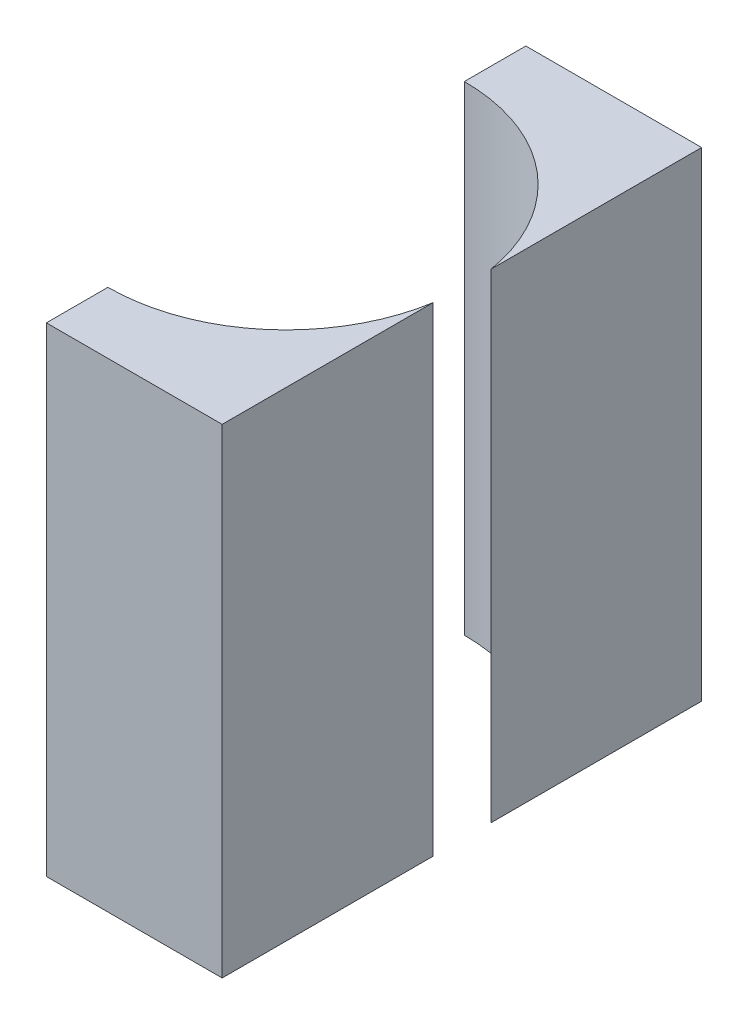
ISO-10303-21;
HEADER;
FILE_DESCRIPTION(('STEP AP214'),'2;1');
FILE_NAME('part.step','',(''),(''),'','','');
FILE_SCHEMA(('AUTOMOTIVE_DESIGN { 1 0 10303 214 1 1 1 1 }'));
ENDSEC;
DATA;
#1=APPLICATION_CONTEXT('core data for automotive mechanical design processes');
#2=APPLICATION_PROTOCOL_DEFINITION('international standard','automotive_design',2000,#1);
#3=PRODUCT_CONTEXT('',#1,'mechanical');
#4=PRODUCT('Part','Part','',(#3));
#5=PRODUCT_RELATED_PRODUCT_CATEGORY('part','',(#4));
#6=PRODUCT_DEFINITION_FORMATION('','',#4);
#7=PRODUCT_DEFINITION_CONTEXT('part definition',#1,'design');
#8=PRODUCT_DEFINITION('design','',#6,#7);
#9=PRODUCT_DEFINITION_SHAPE('','',#8);
#10=(LENGTH_UNIT() NAMED_UNIT(*) SI_UNIT(.MILLI.,.METRE.));
#11=(NAMED_UNIT(*) PLANE_ANGLE_UNIT() SI_UNIT($,.RADIAN.));
#12=(NAMED_UNIT(*) SI_UNIT($,.STERADIAN.) SOLID_ANGLE_UNIT());
#13=UNCERTAINTY_MEASURE_WITH_UNIT(LENGTH_MEASURE(1.E-05),#10,'distance_accuracy_value','');
#14=(GEOMETRIC_REPRESENTATION_CONTEXT(3) GLOBAL_UNCERTAINTY_ASSIGNED_CONTEXT((#13)) GLOBAL_UNIT_ASSIGNED_CONTEXT((#10,
#11,#12)) REPRESENTATION_CONTEXT('',''));
#15=CARTESIAN_POINT('',(0.,0.,0.));
#16=DIRECTION('',(0.,0.,1.));
#17=DIRECTION('',(1.,0.,0.));
#18=AXIS2_PLACEMENT_3D('',#15,#16,#17);
#19=CARTESIAN_POINT('',(234.78754847334,39.5040110499967,-22.2466848749254));
#20=DIRECTION('',(0.,1.,0.));
#21=DIRECTION('',(-1.,0.,0.));
#22=AXIS2_PLACEMENT_3D('',#19,#20,#21);
#23=CYLINDRICAL_SURFACE('',#22,11.15);
#24=CARTESIAN_POINT('',(234.78754847334,56.6690721218171,-22.2466848749254));
#25=DIRECTION('',(0.,-1.,0.));
#26=DIRECTION('',(1.,0.,0.));
#27=AXIS2_PLACEMENT_3D('',#24,#25,#26);
#28=CIRCLE('',#27,11.15);
#29=CARTESIAN_POINT('',(245.78754847334,56.6690721218171,-24.0694574882816));
#30=VERTEX_POINT('',#29);
#31=CARTESIAN_POINT('',(234.78754847334,56.6690721218171,-33.3966848749254));
#32=VERTEX_POINT('',#31);
#33=EDGE_CURVE('E12',#30,#32,#28,.F.);
#34=ORIENTED_EDGE('',*,*,#33,.F.);
#35=DIRECTION('',(0.,1.,0.));
#36=VECTOR('',#35,1.);
#37=CARTESIAN_POINT('',(245.78754847334,39.5040110499967,-24.0694574882816));
#38=LINE('',#37,#36);
#39=CARTESIAN_POINT('',(245.78754847334,86.6690721218171,-24.0694574882816));
#40=VERTEX_POINT('',#39);
#41=EDGE_CURVE('E55',#30,#40,#38,.T.);
#42=ORIENTED_EDGE('',*,*,#41,.T.);
#43=CARTESIAN_POINT('',(234.78754847334,86.6690721218171,-22.2466848749254));
#44=DIRECTION('',(0.,1.,0.));
#45=DIRECTION('',(0.,0.,1.));
#46=AXIS2_PLACEMENT_3D('',#43,#44,#45);
#47=CIRCLE('',#46,11.15);
#48=CARTESIAN_POINT('',(234.78754847334,86.6690721218171,-33.3966848749254));
#49=VERTEX_POINT('',#48);
#50=EDGE_CURVE('E116',#40,#49,#47,.T.);
#51=ORIENTED_EDGE('',*,*,#50,.T.);
#52=DIRECTION('',(0.,1.,0.));
#53=VECTOR('',#52,1.);
#54=CARTESIAN_POINT('',(234.78754847334,39.5040110499967,-33.3966848749254));
#55=LINE('',#54,#53);
#56=EDGE_CURVE('E110',#32,#49,#55,.T.);
#57=ORIENTED_EDGE('',*,*,#56,.F.);
#58=EDGE_LOOP('',(#34,#42,#51,#57));
#59=FACE_BOUND('',#58,.T.);
#60=ADVANCED_FACE('F51',(#59),#23,.F.);
#61=CARTESIAN_POINT('',(234.78754847334,39.5040110499967,0.));
#62=DIRECTION('',(-1.,0.,0.));
#63=DIRECTION('',(0.,-1.,0.));
#64=AXIS2_PLACEMENT_3D('',#61,#62,#63);
#65=PLANE('',#64);
#66=DIRECTION('',(0.,1.,0.));
#67=VECTOR('',#66,1.);
#68=CARTESIAN_POINT('',(234.78754847334,39.5040110499967,-37.2466848749251));
#69=LINE('',#68,#67);
#70=CARTESIAN_POINT('',(234.78754847334,56.6690721218171,-37.2466848749251));
#71=VERTEX_POINT('',#70);
#72=CARTESIAN_POINT('',(234.78754847334,86.6690721218171,-37.2466848749251));
#73=VERTEX_POINT('',#72);
#74=EDGE_CURVE('E104',#71,#73,#69,.T.);
#75=ORIENTED_EDGE('',*,*,#74,.F.);
#76=DIRECTION('',(0.,0.,1.));
#77=VECTOR('',#76,1.);
#78=CARTESIAN_POINT('',(234.78754847334,56.6690721218171,0.));
#79=LINE('',#78,#77);
#80=EDGE_CURVE('E90',#71,#32,#79,.T.);
#81=ORIENTED_EDGE('',*,*,#80,.T.);
#82=ORIENTED_EDGE('',*,*,#56,.T.);
#83=DIRECTION('',(0.,0.,1.));
#84=VECTOR('',#83,1.);
#85=CARTESIAN_POINT('',(234.78754847334,86.6690721218171,0.));
#86=LINE('',#85,#84);
#87=EDGE_CURVE('E108',#73,#49,#86,.T.);
#88=ORIENTED_EDGE('',*,*,#87,.F.);
#89=EDGE_LOOP('',(#75,#81,#82,#88));
#90=FACE_BOUND('',#89,.T.);
#91=ADVANCED_FACE('F125',(#90),#65,.T.);
#92=CARTESIAN_POINT('',(0.,39.5040110499967,-37.2466848749251));
#93=DIRECTION('',(0.,0.,-1.));
#94=DIRECTION('',(0.,1.,0.));
#95=AXIS2_PLACEMENT_3D('',#92,#93,#94);
#96=PLANE('',#95);
#97=DIRECTION('',(0.,1.,0.));
#98=VECTOR('',#97,1.);
#99=CARTESIAN_POINT('',(245.78754847334,39.5040110499967,-37.2466848749251));
#100=LINE('',#99,#98);
#101=CARTESIAN_POINT('',(245.78754847334,56.6690721218171,-37.2466848749251));
#102=VERTEX_POINT('',#101);
#103=CARTESIAN_POINT('',(245.78754847334,86.6690721218171,-37.2466848749251));
#104=VERTEX_POINT('',#103);
#105=EDGE_CURVE('E73',#102,#104,#100,.T.);
#106=ORIENTED_EDGE('',*,*,#105,.F.);
#107=DIRECTION('',(-1.,0.,0.));
#108=VECTOR('',#107,1.);
#109=CARTESIAN_POINT('',(0.,56.669072121817,-37.2466848749251));
#110=LINE('',#109,#108);
#111=EDGE_CURVE('E98',#102,#71,#110,.T.);
#112=ORIENTED_EDGE('',*,*,#111,.T.);
#113=ORIENTED_EDGE('',*,*,#74,.T.);
#114=DIRECTION('',(-1.,0.,0.));
#115=VECTOR('',#114,1.);
#116=CARTESIAN_POINT('',(0.,86.6690721218171,-37.2466848749251));
#117=LINE('',#116,#115);
#118=EDGE_CURVE('E102',#104,#73,#117,.T.);
#119=ORIENTED_EDGE('',*,*,#118,.F.);
#120=EDGE_LOOP('',(#106,#112,#113,#119));
#121=FACE_BOUND('',#120,.T.);
#122=ADVANCED_FACE('F100',(#121),#96,.T.);
#123=CARTESIAN_POINT('',(245.78754847334,39.5040110499967,-1.74128559289128E-13));
#124=DIRECTION('',(-1.,0.,0.));
#125=DIRECTION('',(0.,0.,1.));
#126=AXIS2_PLACEMENT_3D('',#123,#124,#125);
#127=PLANE('',#126);
#128=DIRECTION('',(0.,0.,1.));
#129=VECTOR('',#128,1.);
#130=CARTESIAN_POINT('',(245.78754847334,56.6690721218171,-1.74144931692011E-13));
#131=LINE('',#130,#129);
#132=EDGE_CURVE('E60',#102,#30,#131,.T.);
#133=ORIENTED_EDGE('',*,*,#132,.F.);
#134=ORIENTED_EDGE('',*,*,#105,.T.);
#135=DIRECTION('',(0.,0.,1.));
#136=VECTOR('',#135,1.);
#137=CARTESIAN_POINT('',(245.78754847334,86.6690721218171,-1.74173546334535E-13));
#138=LINE('',#137,#136);
#139=EDGE_CURVE('E103',#104,#40,#138,.T.);
#140=ORIENTED_EDGE('',*,*,#139,.T.);
#141=ORIENTED_EDGE('',*,*,#41,.F.);
#142=EDGE_LOOP('',(#133,#134,#140,#141));
#143=FACE_BOUND('',#142,.T.);
#144=ADVANCED_FACE('F106',(#143),#127,.F.);
#145=CARTESIAN_POINT('',(0.,86.6690721218171,0.));
#146=DIRECTION('',(0.,1.,0.));
#147=DIRECTION('',(0.,0.,1.));
#148=AXIS2_PLACEMENT_3D('',#145,#146,#147);
#149=PLANE('',#148);
#150=ORIENTED_EDGE('',*,*,#50,.F.);
#151=ORIENTED_EDGE('',*,*,#139,.F.);
#152=ORIENTED_EDGE('',*,*,#118,.T.);
#153=ORIENTED_EDGE('',*,*,#87,.T.);
#154=EDGE_LOOP('',(#150,#151,#152,#153));
#155=FACE_BOUND('',#154,.T.);
#156=ADVANCED_FACE('F122',(#155),#149,.T.);
#157=CARTESIAN_POINT('',(255.78754847334,56.6690721218171,-37.2466848749252));
#158=DIRECTION('',(0.,-1.,0.));
#159=DIRECTION('',(0.,0.,1.));
#160=AXIS2_PLACEMENT_3D('',#157,#158,#159);
#161=PLANE('',#160);
#162=ORIENTED_EDGE('',*,*,#132,.T.);
#163=ORIENTED_EDGE('',*,*,#33,.T.);
#164=ORIENTED_EDGE('',*,*,#80,.F.);
#165=ORIENTED_EDGE('',*,*,#111,.F.);
#166=EDGE_LOOP('',(#162,#163,#164,#165));
#167=FACE_BOUND('',#166,.T.);
#168=ADVANCED_FACE('F53',(#167),#161,.T.);
#169=CLOSED_SHELL('',(#60,#91,#122,#144,#156,#168));
#170=MANIFOLD_SOLID_BREP('B2',#169);
#171=CARTESIAN_POINT('',(234.78754847334,39.5040110499967,-22.2466848749254));
#172=DIRECTION('',(0.,1.,0.));
#173=DIRECTION('',(-1.,0.,0.));
#174=AXIS2_PLACEMENT_3D('',#171,#172,#173);
#175=CYLINDRICAL_SURFACE('',#174,11.15);
#176=CARTESIAN_POINT('',(234.78754847334,56.6690721218171,-22.2466848749254));
#177=DIRECTION('',(0.,-1.,0.));
#178=DIRECTION('',(1.,0.,0.));
#179=AXIS2_PLACEMENT_3D('',#176,#177,#178);
#180=CIRCLE('',#179,11.15);
#181=CARTESIAN_POINT('',(234.78754847334,56.6690721218171,-11.0966848749254));
#182=VERTEX_POINT('',#181);
#183=CARTESIAN_POINT('',(245.78754847334,56.6690721218171,-20.4239122615693));
#184=VERTEX_POINT('',#183);
#185=EDGE_CURVE('E187',#182,#184,#180,.F.);
#186=ORIENTED_EDGE('',*,*,#185,.F.);
#187=DIRECTION('',(0.,1.,0.));
#188=VECTOR('',#187,1.);
#189=CARTESIAN_POINT('',(234.78754847334,39.5040110499967,-11.0966848749254));
#190=LINE('',#189,#188);
#191=CARTESIAN_POINT('',(234.78754847334,86.6690721218171,-11.0966848749254));
#192=VERTEX_POINT('',#191);
#193=EDGE_CURVE('E182',#182,#192,#190,.T.);
#194=ORIENTED_EDGE('',*,*,#193,.T.);
#195=CARTESIAN_POINT('',(234.78754847334,86.6690721218171,-22.2466848749254));
#196=DIRECTION('',(0.,1.,0.));
#197=DIRECTION('',(0.,0.,1.));
#198=AXIS2_PLACEMENT_3D('',#195,#196,#197);
#199=CIRCLE('',#198,11.15);
#200=CARTESIAN_POINT('',(245.78754847334,86.6690721218171,-20.4239122615693));
#201=VERTEX_POINT('',#200);
#202=EDGE_CURVE('E246',#192,#201,#199,.T.);
#203=ORIENTED_EDGE('',*,*,#202,.T.);
#204=DIRECTION('',(0.,1.,0.));
#205=VECTOR('',#204,1.);
#206=CARTESIAN_POINT('',(245.78754847334,39.5040110499967,-20.4239122615693));
#207=LINE('',#206,#205);
#208=EDGE_CURVE('E230',#184,#201,#207,.T.);
#209=ORIENTED_EDGE('',*,*,#208,.F.);
#210=EDGE_LOOP('',(#186,#194,#203,#209));
#211=FACE_BOUND('',#210,.T.);
#212=ADVANCED_FACE('F178',(#211),#175,.F.);
#213=CARTESIAN_POINT('',(245.78754847334,39.5040110499967,-2.72874496776734E-12));
#214=DIRECTION('',(1.,0.,0.));
#215=DIRECTION('',(0.,0.,-1.));
#216=AXIS2_PLACEMENT_3D('',#213,#214,#215);
#217=PLANE('',#216);
#218=DIRECTION('',(0.,1.,0.));
#219=VECTOR('',#218,1.);
#220=CARTESIAN_POINT('',(245.78754847334,39.5040110499967,-7.24668487492516));
#221=LINE('',#220,#219);
#222=CARTESIAN_POINT('',(245.78754847334,56.6690721218171,-7.24668487492516));
#223=VERTEX_POINT('',#222);
#224=CARTESIAN_POINT('',(245.78754847334,86.6690721218171,-7.24668487492516));
#225=VERTEX_POINT('',#224);
#226=EDGE_CURVE('E224',#223,#225,#221,.T.);
#227=ORIENTED_EDGE('',*,*,#226,.F.);
#228=DIRECTION('',(0.,0.,-1.));
#229=VECTOR('',#228,1.);
#230=CARTESIAN_POINT('',(245.78754847334,56.6690721218171,-2.72876134017022E-12));
#231=LINE('',#230,#229);
#232=EDGE_CURVE('E217',#223,#184,#231,.T.);
#233=ORIENTED_EDGE('',*,*,#232,.T.);
#234=ORIENTED_EDGE('',*,*,#208,.T.);
#235=DIRECTION('',(0.,0.,-1.));
#236=VECTOR('',#235,1.);
#237=CARTESIAN_POINT('',(245.78754847334,86.6690721218171,-2.72878995481274E-12));
#238=LINE('',#237,#236);
#239=EDGE_CURVE('E236',#225,#201,#238,.T.);
#240=ORIENTED_EDGE('',*,*,#239,.F.);
#241=EDGE_LOOP('',(#227,#233,#234,#240));
#242=FACE_BOUND('',#241,.T.);
#243=ADVANCED_FACE('F239',(#242),#217,.T.);
#244=CARTESIAN_POINT('',(0.,39.5040110499967,-7.24668487492512));
#245=DIRECTION('',(0.,0.,-1.));
#246=DIRECTION('',(-1.,0.,0.));
#247=AXIS2_PLACEMENT_3D('',#244,#245,#246);
#248=PLANE('',#247);
#249=DIRECTION('',(-1.,0.,0.));
#250=VECTOR('',#249,1.);
#251=CARTESIAN_POINT('',(0.,56.669072121817,-7.24668487492512));
#252=LINE('',#251,#250);
#253=CARTESIAN_POINT('',(234.78754847334,56.6690721218171,-7.24668487492516));
#254=VERTEX_POINT('',#253);
#255=EDGE_CURVE('E49',#223,#254,#252,.T.);
#256=ORIENTED_EDGE('',*,*,#255,.F.);
#257=ORIENTED_EDGE('',*,*,#226,.T.);
#258=DIRECTION('',(-1.,0.,0.));
#259=VECTOR('',#258,1.);
#260=CARTESIAN_POINT('',(0.,86.6690721218171,-7.24668487492512));
#261=LINE('',#260,#259);
#262=CARTESIAN_POINT('',(234.78754847334,86.6690721218171,-7.24668487492516));
#263=VERTEX_POINT('',#262);
#264=EDGE_CURVE('E227',#225,#263,#261,.T.);
#265=ORIENTED_EDGE('',*,*,#264,.T.);
#266=DIRECTION('',(0.,1.,0.));
#267=VECTOR('',#266,1.);
#268=CARTESIAN_POINT('',(234.78754847334,39.5040110499967,-7.24668487492516));
#269=LINE('',#268,#267);
#270=EDGE_CURVE('E200',#254,#263,#269,.T.);
#271=ORIENTED_EDGE('',*,*,#270,.F.);
#272=EDGE_LOOP('',(#256,#257,#265,#271));
#273=FACE_BOUND('',#272,.T.);
#274=ADVANCED_FACE('F226',(#273),#248,.F.);
#275=CARTESIAN_POINT('',(234.78754847334,39.5040110499967,0.));
#276=DIRECTION('',(1.,0.,0.));
#277=DIRECTION('',(0.,1.,0.));
#278=AXIS2_PLACEMENT_3D('',#275,#276,#277);
#279=PLANE('',#278);
#280=DIRECTION('',(0.,0.,-1.));
#281=VECTOR('',#280,1.);
#282=CARTESIAN_POINT('',(234.78754847334,56.6690721218171,0.));
#283=LINE('',#282,#281);
#284=EDGE_CURVE('E240',#254,#182,#283,.T.);
#285=ORIENTED_EDGE('',*,*,#284,.F.);
#286=ORIENTED_EDGE('',*,*,#270,.T.);
#287=DIRECTION('',(0.,0.,-1.));
#288=VECTOR('',#287,1.);
#289=CARTESIAN_POINT('',(234.78754847334,86.6690721218171,0.));
#290=LINE('',#289,#288);
#291=EDGE_CURVE('E237',#263,#192,#290,.T.);
#292=ORIENTED_EDGE('',*,*,#291,.T.);
#293=ORIENTED_EDGE('',*,*,#193,.F.);
#294=EDGE_LOOP('',(#285,#286,#292,#293));
#295=FACE_BOUND('',#294,.T.);
#296=ADVANCED_FACE('F260',(#295),#279,.F.);
#297=CARTESIAN_POINT('',(0.,86.6690721218171,0.));
#298=DIRECTION('',(0.,1.,0.));
#299=DIRECTION('',(0.,0.,1.));
#300=AXIS2_PLACEMENT_3D('',#297,#298,#299);
#301=PLANE('',#300);
#302=ORIENTED_EDGE('',*,*,#202,.F.);
#303=ORIENTED_EDGE('',*,*,#291,.F.);
#304=ORIENTED_EDGE('',*,*,#264,.F.);
#305=ORIENTED_EDGE('',*,*,#239,.T.);
#306=EDGE_LOOP('',(#302,#303,#304,#305));
#307=FACE_BOUND('',#306,.T.);
#308=ADVANCED_FACE('F235',(#307),#301,.T.);
#309=CARTESIAN_POINT('',(255.78754847334,56.6690721218171,-37.2466848749252));
#310=DIRECTION('',(0.,-1.,0.));
#311=DIRECTION('',(0.,0.,1.));
#312=AXIS2_PLACEMENT_3D('',#309,#310,#311);
#313=PLANE('',#312);
#314=ORIENTED_EDGE('',*,*,#284,.T.);
#315=ORIENTED_EDGE('',*,*,#185,.T.);
#316=ORIENTED_EDGE('',*,*,#232,.F.);
#317=ORIENTED_EDGE('',*,*,#255,.T.);
#318=EDGE_LOOP('',(#314,#315,#316,#317));
#319=FACE_BOUND('',#318,.T.);
#320=ADVANCED_FACE('F180',(#319),#313,.T.);
#321=CLOSED_SHELL('',(#212,#243,#274,#296,#308,#320));
#322=MANIFOLD_SOLID_BREP('B6',#321);
#323=ADVANCED_BREP_SHAPE_REPRESENTATION('',(#18,#170,#322),#14);
#324=SHAPE_DEFINITION_REPRESENTATION(#9,#323);
ENDSEC;
END-ISO-10303-21;
